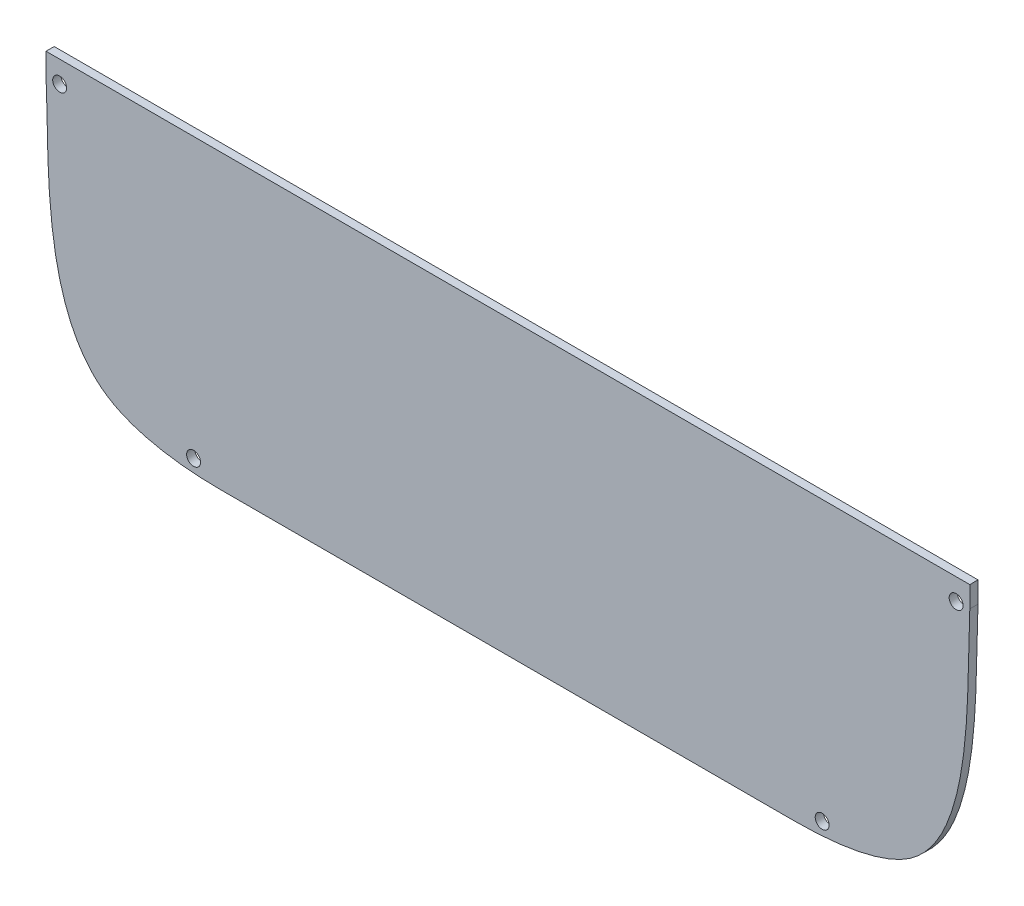
ISO-10303-21;
HEADER;
FILE_DESCRIPTION(('STEP AP214'),'2;1');
FILE_NAME('part.step','',(''),(''),'','','');
FILE_SCHEMA(('AUTOMOTIVE_DESIGN { 1 0 10303 214 1 1 1 1 }'));
ENDSEC;
DATA;
#1=APPLICATION_CONTEXT('core data for automotive mechanical design processes');
#2=APPLICATION_PROTOCOL_DEFINITION('international standard','automotive_design',2000,#1);
#3=PRODUCT_CONTEXT('',#1,'mechanical');
#4=PRODUCT('Part','Part','',(#3));
#5=PRODUCT_RELATED_PRODUCT_CATEGORY('part','',(#4));
#6=PRODUCT_DEFINITION_FORMATION('','',#4);
#7=PRODUCT_DEFINITION_CONTEXT('part definition',#1,'design');
#8=PRODUCT_DEFINITION('design','',#6,#7);
#9=PRODUCT_DEFINITION_SHAPE('','',#8);
#10=(LENGTH_UNIT() NAMED_UNIT(*) SI_UNIT(.MILLI.,.METRE.));
#11=(NAMED_UNIT(*) PLANE_ANGLE_UNIT() SI_UNIT($,.RADIAN.));
#12=(NAMED_UNIT(*) SI_UNIT($,.STERADIAN.) SOLID_ANGLE_UNIT());
#13=UNCERTAINTY_MEASURE_WITH_UNIT(LENGTH_MEASURE(1.E-05),#10,'distance_accuracy_value','');
#14=(GEOMETRIC_REPRESENTATION_CONTEXT(3) GLOBAL_UNCERTAINTY_ASSIGNED_CONTEXT((#13)) GLOBAL_UNIT_ASSIGNED_CONTEXT((#10,
#11,#12)) REPRESENTATION_CONTEXT('',''));
#15=CARTESIAN_POINT('',(0.,0.,0.));
#16=DIRECTION('',(0.,0.,1.));
#17=DIRECTION('',(1.,0.,0.));
#18=AXIS2_PLACEMENT_3D('',#15,#16,#17);
#19=CARTESIAN_POINT('',(-160.596628594768,-26.9627651945104,3.));
#20=DIRECTION('',(0.,0.,1.));
#21=DIRECTION('',(1.,0.,0.));
#22=AXIS2_PLACEMENT_3D('',#19,#20,#21);
#23=PLANE('',#22);
#24=CARTESIAN_POINT('',(164.008250026528,45.0944939733276,3.));
#25=DIRECTION('',(0.,0.,1.));
#26=DIRECTION('',(1.,0.,0.));
#27=AXIS2_PLACEMENT_3D('',#24,#25,#26);
#28=CIRCLE('',#27,2.54999999999999);
#29=CARTESIAN_POINT('',(166.558250026528,45.0944939733276,3.));
#30=VERTEX_POINT('',#29);
#31=EDGE_CURVE('E204',#30,#30,#28,.T.);
#32=ORIENTED_EDGE('',*,*,#31,.F.);
#33=EDGE_LOOP('',(#32));
#34=FACE_BOUND('',#33,.T.);
#35=CARTESIAN_POINT('',(-164.008250026528,45.0944939733276,3.));
#36=DIRECTION('',(0.,0.,1.));
#37=DIRECTION('',(1.,0.,0.));
#38=AXIS2_PLACEMENT_3D('',#35,#36,#37);
#39=CIRCLE('',#38,2.54999999999999);
#40=CARTESIAN_POINT('',(-161.458250026528,45.0944939733276,3.));
#41=VERTEX_POINT('',#40);
#42=EDGE_CURVE('E129',#41,#41,#39,.T.);
#43=ORIENTED_EDGE('',*,*,#42,.F.);
#44=EDGE_LOOP('',(#43));
#45=FACE_BOUND('',#44,.T.);
#46=CARTESIAN_POINT('',(-169.008250026524,45.3145349827066,3.));
#47=CARTESIAN_POINT('',(-168.975148792681,44.6839713637119,3.));
#48=CARTESIAN_POINT('',(-168.916739733158,43.436637469304,3.));
#49=CARTESIAN_POINT('',(-168.817878604295,40.8276209774619,3.));
#50=CARTESIAN_POINT('',(-168.724670595182,37.4371767269644,3.));
#51=CARTESIAN_POINT('',(-168.637619603617,33.1600967454052,3.));
#52=CARTESIAN_POINT('',(-168.526520826733,27.223607092205,3.));
#53=CARTESIAN_POINT('',(-168.344262075909,19.4318461017166,3.));
#54=CARTESIAN_POINT('',(-167.892991030831,9.73556333372438,3.));
#55=CARTESIAN_POINT('',(-167.050380257904,-0.0448830330715194,3.));
#56=CARTESIAN_POINT('',(-165.206606420706,-12.8357834752935,3.));
#57=CARTESIAN_POINT('',(-161.99162754597,-24.6823750590774,3.));
#58=CARTESIAN_POINT('',(-157.002885973682,-34.4851933613224,3.));
#59=CARTESIAN_POINT('',(-153.108804799802,-39.5882756737351,3.));
#60=CARTESIAN_POINT('',(-149.463967226115,-43.0152713849461,3.));
#61=CARTESIAN_POINT('',(-146.457254694338,-45.2406443536804,3.));
#62=CARTESIAN_POINT('',(-143.046435341004,-47.1780255096941,3.));
#63=CARTESIAN_POINT('',(-137.977949801987,-49.4156943672332,3.));
#64=CARTESIAN_POINT('',(-130.886920155165,-51.5401813736999,3.));
#65=CARTESIAN_POINT('',(-123.340327478344,-52.8496075116466,3.));
#66=CARTESIAN_POINT('',(-117.368936618999,-53.4960041403701,3.));
#67=CARTESIAN_POINT('',(-113.002635878587,-53.8065983884418,3.));
#68=CARTESIAN_POINT('',(-109.533261796195,-53.9428585932514,3.));
#69=CARTESIAN_POINT('',(-106.881350102046,-53.9925309906049,3.));
#70=CARTESIAN_POINT('',(-105.63365026529,-54.,3.));
#71=CARTESIAN_POINT('',(-105.,-54.,3.));
#72=B_SPLINE_CURVE_WITH_KNOTS('',3,(#46,#47,#48,#49,#50,#51,#52,#53,#54,#55,#56,#57,#58,#59,#60,
#61,#62,#63,#64,#65,#66,#67,#68,#69,#70,#71),.UNSPECIFIED.,.F.,.F.,(4,1,1,1,1,1,1,1,1,1,1,1,1,1,
1,1,1,1,1,1,1,1,1,4),(0.,0.015625,0.03125,0.0625,0.09375,0.125,0.1875,0.25,0.3125,0.375,0.5,
0.5625,0.625,0.65625,0.6875,0.71875,0.75,0.8125,0.875,0.90625,0.9375,0.96875,0.984375,1.),.UNSPECIFIED.);
#73=CARTESIAN_POINT('',(-169.008250026524,45.3145349827066,3.));
#74=VERTEX_POINT('',#73);
#75=CARTESIAN_POINT('',(-105.,-54.,3.));
#76=VERTEX_POINT('',#75);
#77=EDGE_CURVE('E144',#74,#76,#72,.T.);
#78=ORIENTED_EDGE('',*,*,#77,.T.);
#79=DIRECTION('',(1.,0.,0.));
#80=VECTOR('',#79,1.);
#81=CARTESIAN_POINT('',(-105.,-54.,3.));
#82=LINE('',#81,#80);
#83=CARTESIAN_POINT('',(105.,-54.,3.));
#84=VERTEX_POINT('',#83);
#85=EDGE_CURVE('E91',#76,#84,#82,.T.);
#86=ORIENTED_EDGE('',*,*,#85,.T.);
#87=CARTESIAN_POINT('',(105.,-54.,3.));
#88=CARTESIAN_POINT('',(105.63365026529,-54.,3.));
#89=CARTESIAN_POINT('',(106.881350102046,-53.9925309906048,3.));
#90=CARTESIAN_POINT('',(109.533261796195,-53.9428585932513,3.));
#91=CARTESIAN_POINT('',(113.002635878587,-53.8065983884417,3.));
#92=CARTESIAN_POINT('',(117.368936618999,-53.4960041403701,3.));
#93=CARTESIAN_POINT('',(123.340327478344,-52.8496075116465,3.));
#94=CARTESIAN_POINT('',(130.886920155165,-51.5401813736999,3.));
#95=CARTESIAN_POINT('',(137.977949801987,-49.4156943672332,3.));
#96=CARTESIAN_POINT('',(143.046435341004,-47.178025509694,3.));
#97=CARTESIAN_POINT('',(146.457254694338,-45.2406443536803,3.));
#98=CARTESIAN_POINT('',(149.463967226115,-43.0152713849461,3.));
#99=CARTESIAN_POINT('',(153.108804799802,-39.588275673735,3.));
#100=CARTESIAN_POINT('',(157.002885973682,-34.4851933613223,3.));
#101=CARTESIAN_POINT('',(161.99162754597,-24.6823750590773,3.));
#102=CARTESIAN_POINT('',(165.206606420706,-12.8357834752934,3.));
#103=CARTESIAN_POINT('',(167.050380257904,-0.0448830330714587,3.));
#104=CARTESIAN_POINT('',(167.892991030831,9.73556333372444,3.));
#105=CARTESIAN_POINT('',(168.344262075909,19.4318461017167,3.));
#106=CARTESIAN_POINT('',(168.526520826733,27.223607092205,3.));
#107=CARTESIAN_POINT('',(168.637619603617,33.1600967454052,3.));
#108=CARTESIAN_POINT('',(168.724670595182,37.4371767269644,3.));
#109=CARTESIAN_POINT('',(168.817878604295,40.827620977462,3.));
#110=CARTESIAN_POINT('',(168.916739733158,43.436637469304,3.));
#111=CARTESIAN_POINT('',(168.975148792681,44.683971363712,3.));
#112=CARTESIAN_POINT('',(169.008250026524,45.3145349827067,3.));
#113=B_SPLINE_CURVE_WITH_KNOTS('',3,(#87,#88,#89,#90,#91,#92,#93,#94,#95,#96,#97,#98,#99,#100,
#101,#102,#103,#104,#105,#106,#107,#108,#109,#110,#111,#112),.UNSPECIFIED.,.F.,.F.,(4,1,1,1,1,1,
1,1,1,1,1,1,1,1,1,1,1,1,1,1,1,1,1,4),(0.,0.015625,0.03125,0.0625,0.09375,0.125,0.1875,0.25,
0.28125,0.3125,0.34375,0.375,0.4375,0.5,0.625,0.6875,0.75,0.8125,0.875,0.90625,0.9375,0.96875,
0.984375,1.),.UNSPECIFIED.);
#114=CARTESIAN_POINT('',(169.008250026524,45.3145349827067,3.));
#115=VERTEX_POINT('',#114);
#116=EDGE_CURVE('E104',#84,#115,#113,.T.);
#117=ORIENTED_EDGE('',*,*,#116,.T.);
#118=DIRECTION('',(0.,1.,0.));
#119=VECTOR('',#118,1.);
#120=CARTESIAN_POINT('',(169.008250026524,45.3145349827067,3.));
#121=LINE('',#120,#119);
#122=CARTESIAN_POINT('',(169.008250026524,53.,3.));
#123=VERTEX_POINT('',#122);
#124=EDGE_CURVE('E98',#115,#123,#121,.T.);
#125=ORIENTED_EDGE('',*,*,#124,.T.);
#126=DIRECTION('',(-1.,0.,0.));
#127=VECTOR('',#126,1.);
#128=CARTESIAN_POINT('',(169.008250026524,53.,3.));
#129=LINE('',#128,#127);
#130=CARTESIAN_POINT('',(-169.008250026524,53.,3.));
#131=VERTEX_POINT('',#130);
#132=EDGE_CURVE('E102',#123,#131,#129,.T.);
#133=ORIENTED_EDGE('',*,*,#132,.T.);
#134=DIRECTION('',(0.,-1.,0.));
#135=VECTOR('',#134,1.);
#136=CARTESIAN_POINT('',(-169.008250026524,53.,3.));
#137=LINE('',#136,#135);
#138=EDGE_CURVE('E55',#131,#74,#137,.T.);
#139=ORIENTED_EDGE('',*,*,#138,.T.);
#140=EDGE_LOOP('',(#78,#86,#117,#125,#133,#139));
#141=FACE_BOUND('',#140,.T.);
#142=CARTESIAN_POINT('',(-115.,-49.,3.));
#143=DIRECTION('',(0.,0.,1.));
#144=DIRECTION('',(1.,0.,0.));
#145=AXIS2_PLACEMENT_3D('',#142,#143,#144);
#146=CIRCLE('',#145,2.54999999999999);
#147=CARTESIAN_POINT('',(-112.45,-49.,3.));
#148=VERTEX_POINT('',#147);
#149=EDGE_CURVE('E210',#148,#148,#146,.T.);
#150=ORIENTED_EDGE('',*,*,#149,.F.);
#151=EDGE_LOOP('',(#150));
#152=FACE_BOUND('',#151,.T.);
#153=CARTESIAN_POINT('',(115.,-49.,3.));
#154=DIRECTION('',(0.,0.,1.));
#155=DIRECTION('',(1.,0.,0.));
#156=AXIS2_PLACEMENT_3D('',#153,#154,#155);
#157=CIRCLE('',#156,2.54999999999999);
#158=CARTESIAN_POINT('',(117.55,-49.,3.));
#159=VERTEX_POINT('',#158);
#160=EDGE_CURVE('E195',#159,#159,#157,.T.);
#161=ORIENTED_EDGE('',*,*,#160,.F.);
#162=EDGE_LOOP('',(#161));
#163=FACE_BOUND('',#162,.T.);
#164=ADVANCED_FACE('F37',(#34,#45,#141,#152,#163),#23,.T.);
#165=CARTESIAN_POINT('',(-160.596628594768,-26.9627651945104,0.));
#166=DIRECTION('',(0.,0.,1.));
#167=DIRECTION('',(1.,0.,0.));
#168=AXIS2_PLACEMENT_3D('',#165,#166,#167);
#169=PLANE('',#168);
#170=CARTESIAN_POINT('',(-169.008250026524,45.3145349827066,0.));
#171=CARTESIAN_POINT('',(-168.975148792681,44.6839713637119,0.));
#172=CARTESIAN_POINT('',(-168.916739733158,43.436637469304,0.));
#173=CARTESIAN_POINT('',(-168.817878604295,40.8276209774619,0.));
#174=CARTESIAN_POINT('',(-168.724670595182,37.4371767269644,0.));
#175=CARTESIAN_POINT('',(-168.637619603617,33.1600967454052,0.));
#176=CARTESIAN_POINT('',(-168.526520826733,27.223607092205,0.));
#177=CARTESIAN_POINT('',(-168.344262075909,19.4318461017166,0.));
#178=CARTESIAN_POINT('',(-167.892991030831,9.73556333372438,0.));
#179=CARTESIAN_POINT('',(-167.050380257904,-0.0448830330715194,0.));
#180=CARTESIAN_POINT('',(-165.206606420706,-12.8357834752935,0.));
#181=CARTESIAN_POINT('',(-161.99162754597,-24.6823750590774,0.));
#182=CARTESIAN_POINT('',(-157.002885973682,-34.4851933613224,0.));
#183=CARTESIAN_POINT('',(-153.108804799802,-39.5882756737351,0.));
#184=CARTESIAN_POINT('',(-149.463967226115,-43.0152713849461,0.));
#185=CARTESIAN_POINT('',(-146.457254694338,-45.2406443536804,0.));
#186=CARTESIAN_POINT('',(-143.046435341004,-47.1780255096941,0.));
#187=CARTESIAN_POINT('',(-137.977949801987,-49.4156943672332,0.));
#188=CARTESIAN_POINT('',(-130.886920155165,-51.5401813736999,0.));
#189=CARTESIAN_POINT('',(-123.340327478344,-52.8496075116466,0.));
#190=CARTESIAN_POINT('',(-117.368936618999,-53.4960041403701,0.));
#191=CARTESIAN_POINT('',(-113.002635878587,-53.8065983884418,0.));
#192=CARTESIAN_POINT('',(-109.533261796195,-53.9428585932514,0.));
#193=CARTESIAN_POINT('',(-106.881350102046,-53.9925309906049,0.));
#194=CARTESIAN_POINT('',(-105.63365026529,-54.,0.));
#195=CARTESIAN_POINT('',(-105.,-54.,0.));
#196=B_SPLINE_CURVE_WITH_KNOTS('',3,(#170,#171,#172,#173,#174,#175,#176,#177,#178,#179,#180,
#181,#182,#183,#184,#185,#186,#187,#188,#189,#190,#191,#192,#193,#194,#195),.UNSPECIFIED.,.F.,
.F.,(4,1,1,1,1,1,1,1,1,1,1,1,1,1,1,1,1,1,1,1,1,1,1,4),(0.,0.015625,0.03125,0.0625,0.09375,0.125,
0.1875,0.25,0.3125,0.375,0.5,0.5625,0.625,0.65625,0.6875,0.71875,0.75,0.8125,0.875,0.90625,
0.9375,0.96875,0.984375,1.),.UNSPECIFIED.);
#197=CARTESIAN_POINT('',(-169.008250026524,45.3145349827066,0.));
#198=VERTEX_POINT('',#197);
#199=CARTESIAN_POINT('',(-105.,-54.,0.));
#200=VERTEX_POINT('',#199);
#201=EDGE_CURVE('E123',#198,#200,#196,.T.);
#202=ORIENTED_EDGE('',*,*,#201,.F.);
#203=DIRECTION('',(0.,-1.,0.));
#204=VECTOR('',#203,1.);
#205=CARTESIAN_POINT('',(-169.008250026524,53.,0.));
#206=LINE('',#205,#204);
#207=CARTESIAN_POINT('',(-169.008250026524,53.,0.));
#208=VERTEX_POINT('',#207);
#209=EDGE_CURVE('E83',#208,#198,#206,.T.);
#210=ORIENTED_EDGE('',*,*,#209,.F.);
#211=DIRECTION('',(-1.,0.,0.));
#212=VECTOR('',#211,1.);
#213=CARTESIAN_POINT('',(159.008250026528,53.,0.));
#214=LINE('',#213,#212);
#215=CARTESIAN_POINT('',(169.008250026524,53.,0.));
#216=VERTEX_POINT('',#215);
#217=EDGE_CURVE('E77',#216,#208,#214,.T.);
#218=ORIENTED_EDGE('',*,*,#217,.F.);
#219=DIRECTION('',(0.,1.,0.));
#220=VECTOR('',#219,1.);
#221=CARTESIAN_POINT('',(169.008250026524,45.3145349827067,0.));
#222=LINE('',#221,#220);
#223=CARTESIAN_POINT('',(169.008250026524,45.3145349827067,0.));
#224=VERTEX_POINT('',#223);
#225=EDGE_CURVE('E113',#224,#216,#222,.T.);
#226=ORIENTED_EDGE('',*,*,#225,.F.);
#227=CARTESIAN_POINT('',(105.,-54.,0.));
#228=CARTESIAN_POINT('',(105.63365026529,-54.,0.));
#229=CARTESIAN_POINT('',(106.881350102046,-53.9925309906048,0.));
#230=CARTESIAN_POINT('',(109.533261796195,-53.9428585932513,0.));
#231=CARTESIAN_POINT('',(113.002635878587,-53.8065983884417,0.));
#232=CARTESIAN_POINT('',(117.368936618999,-53.4960041403701,0.));
#233=CARTESIAN_POINT('',(123.340327478344,-52.8496075116465,0.));
#234=CARTESIAN_POINT('',(130.886920155165,-51.5401813736999,0.));
#235=CARTESIAN_POINT('',(137.977949801987,-49.4156943672332,0.));
#236=CARTESIAN_POINT('',(143.046435341004,-47.178025509694,0.));
#237=CARTESIAN_POINT('',(146.457254694338,-45.2406443536803,0.));
#238=CARTESIAN_POINT('',(149.463967226115,-43.0152713849461,0.));
#239=CARTESIAN_POINT('',(153.108804799802,-39.588275673735,0.));
#240=CARTESIAN_POINT('',(157.002885973682,-34.4851933613223,0.));
#241=CARTESIAN_POINT('',(161.99162754597,-24.6823750590773,0.));
#242=CARTESIAN_POINT('',(165.206606420706,-12.8357834752934,0.));
#243=CARTESIAN_POINT('',(167.050380257904,-0.0448830330714587,0.));
#244=CARTESIAN_POINT('',(167.892991030831,9.73556333372444,0.));
#245=CARTESIAN_POINT('',(168.344262075909,19.4318461017167,0.));
#246=CARTESIAN_POINT('',(168.526520826733,27.223607092205,0.));
#247=CARTESIAN_POINT('',(168.637619603617,33.1600967454052,0.));
#248=CARTESIAN_POINT('',(168.724670595182,37.4371767269644,0.));
#249=CARTESIAN_POINT('',(168.817878604295,40.827620977462,0.));
#250=CARTESIAN_POINT('',(168.916739733158,43.436637469304,0.));
#251=CARTESIAN_POINT('',(168.975148792681,44.683971363712,0.));
#252=CARTESIAN_POINT('',(169.008250026524,45.3145349827067,0.));
#253=B_SPLINE_CURVE_WITH_KNOTS('',3,(#227,#228,#229,#230,#231,#232,#233,#234,#235,#236,#237,
#238,#239,#240,#241,#242,#243,#244,#245,#246,#247,#248,#249,#250,#251,#252),.UNSPECIFIED.,.F.,
.F.,(4,1,1,1,1,1,1,1,1,1,1,1,1,1,1,1,1,1,1,1,1,1,1,4),(0.,0.015625,0.03125,0.0625,0.09375,0.125,
0.1875,0.25,0.28125,0.3125,0.34375,0.375,0.4375,0.5,0.625,0.6875,0.75,0.8125,0.875,0.90625,
0.9375,0.96875,0.984375,1.),.UNSPECIFIED.);
#254=CARTESIAN_POINT('',(105.,-54.,0.));
#255=VERTEX_POINT('',#254);
#256=EDGE_CURVE('E134',#255,#224,#253,.T.);
#257=ORIENTED_EDGE('',*,*,#256,.F.);
#258=DIRECTION('',(1.,0.,0.));
#259=VECTOR('',#258,1.);
#260=CARTESIAN_POINT('',(100.,-54.,0.));
#261=LINE('',#260,#259);
#262=EDGE_CURVE('E128',#200,#255,#261,.T.);
#263=ORIENTED_EDGE('',*,*,#262,.F.);
#264=EDGE_LOOP('',(#202,#210,#218,#226,#257,#263));
#265=FACE_BOUND('',#264,.T.);
#266=CARTESIAN_POINT('',(-164.008250026528,45.0944939733276,0.));
#267=DIRECTION('',(0.,0.,1.));
#268=DIRECTION('',(1.,0.,0.));
#269=AXIS2_PLACEMENT_3D('',#266,#267,#268);
#270=CIRCLE('',#269,2.54999999999999);
#271=CARTESIAN_POINT('',(-161.458250026528,45.0944939733276,0.));
#272=VERTEX_POINT('',#271);
#273=EDGE_CURVE('E213',#272,#272,#270,.T.);
#274=ORIENTED_EDGE('',*,*,#273,.T.);
#275=EDGE_LOOP('',(#274));
#276=FACE_BOUND('',#275,.T.);
#277=CARTESIAN_POINT('',(-115.,-49.,0.));
#278=DIRECTION('',(0.,0.,1.));
#279=DIRECTION('',(1.,0.,0.));
#280=AXIS2_PLACEMENT_3D('',#277,#278,#279);
#281=CIRCLE('',#280,2.54999999999999);
#282=CARTESIAN_POINT('',(-112.45,-49.,0.));
#283=VERTEX_POINT('',#282);
#284=EDGE_CURVE('E207',#283,#283,#281,.T.);
#285=ORIENTED_EDGE('',*,*,#284,.T.);
#286=EDGE_LOOP('',(#285));
#287=FACE_BOUND('',#286,.T.);
#288=CARTESIAN_POINT('',(164.008250026528,45.0944939733276,0.));
#289=DIRECTION('',(0.,0.,1.));
#290=DIRECTION('',(1.,0.,0.));
#291=AXIS2_PLACEMENT_3D('',#288,#289,#290);
#292=CIRCLE('',#291,2.54999999999999);
#293=CARTESIAN_POINT('',(166.558250026528,45.0944939733276,0.));
#294=VERTEX_POINT('',#293);
#295=EDGE_CURVE('E201',#294,#294,#292,.T.);
#296=ORIENTED_EDGE('',*,*,#295,.T.);
#297=EDGE_LOOP('',(#296));
#298=FACE_BOUND('',#297,.T.);
#299=CARTESIAN_POINT('',(115.,-49.,0.));
#300=DIRECTION('',(0.,0.,1.));
#301=DIRECTION('',(1.,0.,0.));
#302=AXIS2_PLACEMENT_3D('',#299,#300,#301);
#303=CIRCLE('',#302,2.54999999999999);
#304=CARTESIAN_POINT('',(117.55,-49.,0.));
#305=VERTEX_POINT('',#304);
#306=EDGE_CURVE('E198',#305,#305,#303,.T.);
#307=ORIENTED_EDGE('',*,*,#306,.T.);
#308=EDGE_LOOP('',(#307));
#309=FACE_BOUND('',#308,.T.);
#310=ADVANCED_FACE('F153',(#265,#276,#287,#298,#309),#169,.F.);
#311=DIRECTION('',(0.,0.,-1.));
#312=VECTOR('',#311,1.);
#313=SURFACE_OF_LINEAR_EXTRUSION('',#72,#312);
#314=ORIENTED_EDGE('',*,*,#201,.T.);
#315=DIRECTION('',(0.,0.,-1.));
#316=VECTOR('',#315,1.);
#317=CARTESIAN_POINT('',(-105.,-54.,3.));
#318=LINE('',#317,#316);
#319=EDGE_CURVE('E11',#76,#200,#318,.T.);
#320=ORIENTED_EDGE('',*,*,#319,.F.);
#321=ORIENTED_EDGE('',*,*,#77,.F.);
#322=DIRECTION('',(0.,0.,-1.));
#323=VECTOR('',#322,1.);
#324=CARTESIAN_POINT('',(-169.008250026524,45.3145349827066,3.));
#325=LINE('',#324,#323);
#326=EDGE_CURVE('E119',#74,#198,#325,.T.);
#327=ORIENTED_EDGE('',*,*,#326,.T.);
#328=EDGE_LOOP('',(#314,#320,#321,#327));
#329=FACE_BOUND('',#328,.T.);
#330=ADVANCED_FACE('F39',(#329),#313,.F.);
#331=CARTESIAN_POINT('',(100.,-54.,3.));
#332=DIRECTION('',(0.,1.,0.));
#333=DIRECTION('',(-1.,0.,0.));
#334=AXIS2_PLACEMENT_3D('',#331,#332,#333);
#335=PLANE('',#334);
#336=ORIENTED_EDGE('',*,*,#262,.T.);
#337=DIRECTION('',(0.,0.,-1.));
#338=VECTOR('',#337,1.);
#339=CARTESIAN_POINT('',(105.,-54.,3.));
#340=LINE('',#339,#338);
#341=EDGE_CURVE('E47',#84,#255,#340,.T.);
#342=ORIENTED_EDGE('',*,*,#341,.F.);
#343=ORIENTED_EDGE('',*,*,#85,.F.);
#344=ORIENTED_EDGE('',*,*,#319,.T.);
#345=EDGE_LOOP('',(#336,#342,#343,#344));
#346=FACE_BOUND('',#345,.T.);
#347=ADVANCED_FACE('F235',(#346),#335,.F.);
#348=DIRECTION('',(0.,0.,-1.));
#349=VECTOR('',#348,1.);
#350=SURFACE_OF_LINEAR_EXTRUSION('',#113,#349);
#351=ORIENTED_EDGE('',*,*,#256,.T.);
#352=DIRECTION('',(0.,0.,-1.));
#353=VECTOR('',#352,1.);
#354=CARTESIAN_POINT('',(169.008250026524,45.3145349827067,3.));
#355=LINE('',#354,#353);
#356=EDGE_CURVE('E114',#115,#224,#355,.T.);
#357=ORIENTED_EDGE('',*,*,#356,.F.);
#358=ORIENTED_EDGE('',*,*,#116,.F.);
#359=ORIENTED_EDGE('',*,*,#341,.T.);
#360=EDGE_LOOP('',(#351,#357,#358,#359));
#361=FACE_BOUND('',#360,.T.);
#362=ADVANCED_FACE('F150',(#361),#350,.F.);
#363=CARTESIAN_POINT('',(169.008250026524,45.3145349827067,3.));
#364=DIRECTION('',(-1.,0.,0.));
#365=DIRECTION('',(0.,0.,1.));
#366=AXIS2_PLACEMENT_3D('',#363,#364,#365);
#367=PLANE('',#366);
#368=ORIENTED_EDGE('',*,*,#225,.T.);
#369=DIRECTION('',(0.,0.,-1.));
#370=VECTOR('',#369,1.);
#371=CARTESIAN_POINT('',(169.008250026524,53.,3.));
#372=LINE('',#371,#370);
#373=EDGE_CURVE('E110',#123,#216,#372,.T.);
#374=ORIENTED_EDGE('',*,*,#373,.F.);
#375=ORIENTED_EDGE('',*,*,#124,.F.);
#376=ORIENTED_EDGE('',*,*,#356,.T.);
#377=EDGE_LOOP('',(#368,#374,#375,#376));
#378=FACE_BOUND('',#377,.T.);
#379=ADVANCED_FACE('F111',(#378),#367,.F.);
#380=CARTESIAN_POINT('',(159.008250026528,53.,3.));
#381=DIRECTION('',(0.,-1.,0.));
#382=DIRECTION('',(1.,0.,0.));
#383=AXIS2_PLACEMENT_3D('',#380,#381,#382);
#384=PLANE('',#383);
#385=ORIENTED_EDGE('',*,*,#217,.T.);
#386=DIRECTION('',(0.,0.,-1.));
#387=VECTOR('',#386,1.);
#388=CARTESIAN_POINT('',(-169.008250026524,53.,3.));
#389=LINE('',#388,#387);
#390=EDGE_CURVE('E115',#131,#208,#389,.T.);
#391=ORIENTED_EDGE('',*,*,#390,.F.);
#392=ORIENTED_EDGE('',*,*,#132,.F.);
#393=ORIENTED_EDGE('',*,*,#373,.T.);
#394=EDGE_LOOP('',(#385,#391,#392,#393));
#395=FACE_BOUND('',#394,.T.);
#396=ADVANCED_FACE('F117',(#395),#384,.F.);
#397=CARTESIAN_POINT('',(-169.008250026524,53.,3.));
#398=DIRECTION('',(1.,0.,0.));
#399=DIRECTION('',(0.,0.,-1.));
#400=AXIS2_PLACEMENT_3D('',#397,#398,#399);
#401=PLANE('',#400);
#402=ORIENTED_EDGE('',*,*,#209,.T.);
#403=ORIENTED_EDGE('',*,*,#326,.F.);
#404=ORIENTED_EDGE('',*,*,#138,.F.);
#405=ORIENTED_EDGE('',*,*,#390,.T.);
#406=EDGE_LOOP('',(#402,#403,#404,#405));
#407=FACE_BOUND('',#406,.T.);
#408=ADVANCED_FACE('F158',(#407),#401,.F.);
#409=CARTESIAN_POINT('',(-164.008250026528,45.0944939733276,3.));
#410=DIRECTION('',(0.,0.,-1.));
#411=DIRECTION('',(-1.,0.,0.));
#412=AXIS2_PLACEMENT_3D('',#409,#410,#411);
#413=CYLINDRICAL_SURFACE('',#412,2.54999999999999);
#414=ORIENTED_EDGE('',*,*,#42,.T.);
#415=EDGE_LOOP('',(#414));
#416=FACE_BOUND('',#415,.T.);
#417=ORIENTED_EDGE('',*,*,#273,.F.);
#418=EDGE_LOOP('',(#417));
#419=FACE_BOUND('',#418,.T.);
#420=ADVANCED_FACE('F160',(#416,#419),#413,.F.);
#421=CARTESIAN_POINT('',(-115.,-49.,3.));
#422=DIRECTION('',(0.,0.,-1.));
#423=DIRECTION('',(-1.,0.,0.));
#424=AXIS2_PLACEMENT_3D('',#421,#422,#423);
#425=CYLINDRICAL_SURFACE('',#424,2.54999999999999);
#426=ORIENTED_EDGE('',*,*,#149,.T.);
#427=EDGE_LOOP('',(#426));
#428=FACE_BOUND('',#427,.T.);
#429=ORIENTED_EDGE('',*,*,#284,.F.);
#430=EDGE_LOOP('',(#429));
#431=FACE_BOUND('',#430,.T.);
#432=ADVANCED_FACE('F166',(#428,#431),#425,.F.);
#433=CARTESIAN_POINT('',(164.008250026528,45.0944939733276,3.));
#434=DIRECTION('',(0.,0.,-1.));
#435=DIRECTION('',(-1.,0.,0.));
#436=AXIS2_PLACEMENT_3D('',#433,#434,#435);
#437=CYLINDRICAL_SURFACE('',#436,2.54999999999999);
#438=ORIENTED_EDGE('',*,*,#31,.T.);
#439=EDGE_LOOP('',(#438));
#440=FACE_BOUND('',#439,.T.);
#441=ORIENTED_EDGE('',*,*,#295,.F.);
#442=EDGE_LOOP('',(#441));
#443=FACE_BOUND('',#442,.T.);
#444=ADVANCED_FACE('F182',(#440,#443),#437,.F.);
#445=CARTESIAN_POINT('',(115.,-49.,3.));
#446=DIRECTION('',(0.,0.,-1.));
#447=DIRECTION('',(-1.,0.,0.));
#448=AXIS2_PLACEMENT_3D('',#445,#446,#447);
#449=CYLINDRICAL_SURFACE('',#448,2.54999999999999);
#450=ORIENTED_EDGE('',*,*,#160,.T.);
#451=EDGE_LOOP('',(#450));
#452=FACE_BOUND('',#451,.T.);
#453=ORIENTED_EDGE('',*,*,#306,.F.);
#454=EDGE_LOOP('',(#453));
#455=FACE_BOUND('',#454,.T.);
#456=ADVANCED_FACE('F186',(#452,#455),#449,.F.);
#457=CLOSED_SHELL('',(#164,#310,#330,#347,#362,#379,#396,#408,#420,#432,#444,#456));
#458=MANIFOLD_SOLID_BREP('B2',#457);
#459=ADVANCED_BREP_SHAPE_REPRESENTATION('',(#18,#458),#14);
#460=SHAPE_DEFINITION_REPRESENTATION(#9,#459);
ENDSEC;
END-ISO-10303-21;
